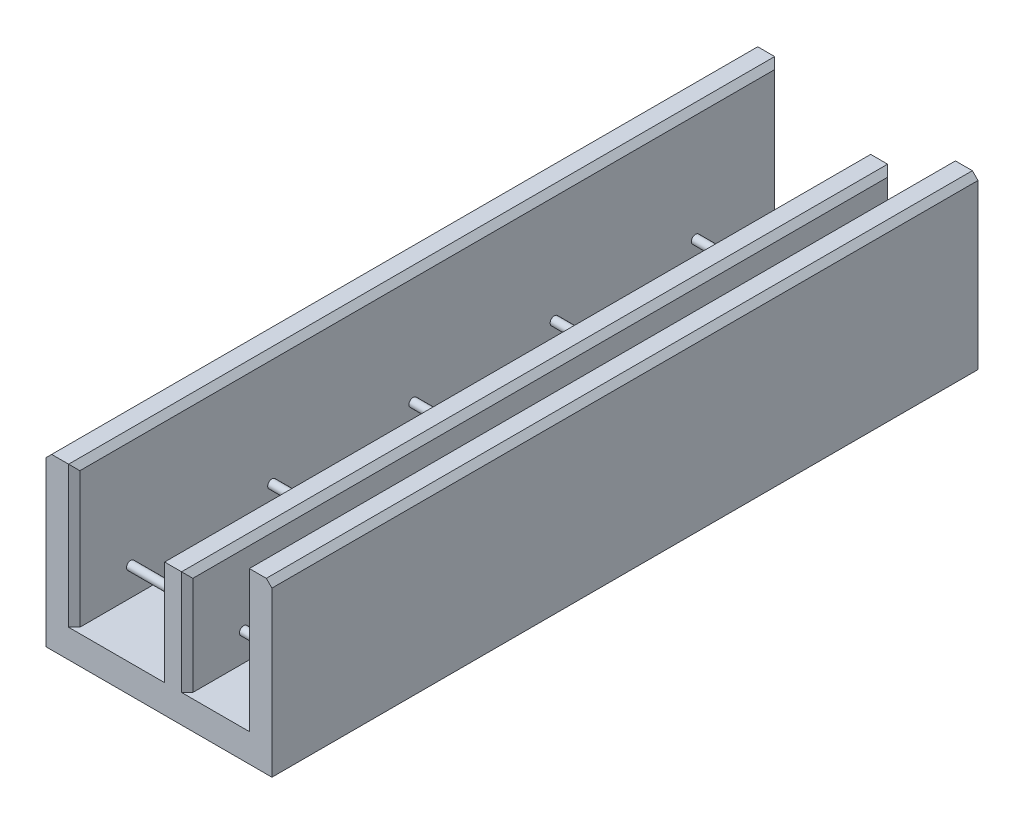
ISO-10303-21;
HEADER;
FILE_DESCRIPTION(('STEP AP214'),'2;1');
FILE_NAME('part.step','',(''),(''),'','','');
FILE_SCHEMA(('AUTOMOTIVE_DESIGN { 1 0 10303 214 1 1 1 1 }'));
ENDSEC;
DATA;
#1=APPLICATION_CONTEXT('core data for automotive mechanical design processes');
#2=APPLICATION_PROTOCOL_DEFINITION('international standard','automotive_design',2000,#1);
#3=PRODUCT_CONTEXT('',#1,'mechanical');
#4=PRODUCT('Part','Part','',(#3));
#5=PRODUCT_RELATED_PRODUCT_CATEGORY('part','',(#4));
#6=PRODUCT_DEFINITION_FORMATION('','',#4);
#7=PRODUCT_DEFINITION_CONTEXT('part definition',#1,'design');
#8=PRODUCT_DEFINITION('design','',#6,#7);
#9=PRODUCT_DEFINITION_SHAPE('','',#8);
#10=(LENGTH_UNIT() NAMED_UNIT(*) SI_UNIT(.MILLI.,.METRE.));
#11=(NAMED_UNIT(*) PLANE_ANGLE_UNIT() SI_UNIT($,.RADIAN.));
#12=(NAMED_UNIT(*) SI_UNIT($,.STERADIAN.) SOLID_ANGLE_UNIT());
#13=UNCERTAINTY_MEASURE_WITH_UNIT(LENGTH_MEASURE(1.E-05),#10,'distance_accuracy_value','');
#14=(GEOMETRIC_REPRESENTATION_CONTEXT(3) GLOBAL_UNCERTAINTY_ASSIGNED_CONTEXT((#13)) GLOBAL_UNIT_ASSIGNED_CONTEXT((#10,
#11,#12)) REPRESENTATION_CONTEXT('',''));
#15=CARTESIAN_POINT('',(0.,0.,0.));
#16=DIRECTION('',(0.,0.,1.));
#17=DIRECTION('',(1.,0.,0.));
#18=AXIS2_PLACEMENT_3D('',#15,#16,#17);
#19=CARTESIAN_POINT('',(0.,600.,2500.));
#20=DIRECTION('',(-1.,0.,0.));
#21=DIRECTION('',(0.,0.,1.));
#22=AXIS2_PLACEMENT_3D('',#19,#20,#21);
#23=PLANE('',#22);
#24=DIRECTION('',(0.,1.,0.));
#25=VECTOR('',#24,1.);
#26=CARTESIAN_POINT('',(0.,600.,0.));
#27=LINE('',#26,#25);
#28=CARTESIAN_POINT('',(0.,0.,0.));
#29=VERTEX_POINT('',#28);
#30=CARTESIAN_POINT('',(0.,580.,0.));
#31=VERTEX_POINT('',#30);
#32=EDGE_CURVE('E219',#29,#31,#27,.T.);
#33=ORIENTED_EDGE('',*,*,#32,.T.);
#34=DIRECTION('',(0.,0.,1.));
#35=VECTOR('',#34,1.);
#36=CARTESIAN_POINT('',(0.,580.,2500.));
#37=LINE('',#36,#35);
#38=CARTESIAN_POINT('',(0.,580.,2500.));
#39=VERTEX_POINT('',#38);
#40=EDGE_CURVE('E289',#31,#39,#37,.T.);
#41=ORIENTED_EDGE('',*,*,#40,.T.);
#42=DIRECTION('',(0.,1.,0.));
#43=VECTOR('',#42,1.);
#44=CARTESIAN_POINT('',(0.,600.,2500.));
#45=LINE('',#44,#43);
#46=CARTESIAN_POINT('',(0.,0.,2500.));
#47=VERTEX_POINT('',#46);
#48=EDGE_CURVE('E238',#47,#39,#45,.T.);
#49=ORIENTED_EDGE('',*,*,#48,.F.);
#50=DIRECTION('',(0.,0.,-1.));
#51=VECTOR('',#50,1.);
#52=CARTESIAN_POINT('',(0.,0.,2500.));
#53=LINE('',#52,#51);
#54=EDGE_CURVE('E210',#47,#29,#53,.T.);
#55=ORIENTED_EDGE('',*,*,#54,.T.);
#56=EDGE_LOOP('',(#33,#41,#49,#55));
#57=FACE_BOUND('',#56,.T.);
#58=ADVANCED_FACE('F37',(#57),#23,.F.);
#59=CARTESIAN_POINT('',(-99.9999999999998,600.,2500.));
#60=DIRECTION('',(0.,-1.,0.));
#61=DIRECTION('',(0.,0.,-1.));
#62=AXIS2_PLACEMENT_3D('',#59,#60,#61);
#63=PLANE('',#62);
#64=DIRECTION('',(-1.,0.,0.));
#65=VECTOR('',#64,1.);
#66=CARTESIAN_POINT('',(-99.9999999999998,600.,2500.));
#67=LINE('',#66,#65);
#68=CARTESIAN_POINT('',(-20.,600.,2500.));
#69=VERTEX_POINT('',#68);
#70=CARTESIAN_POINT('',(-80.,600.,2500.));
#71=VERTEX_POINT('',#70);
#72=EDGE_CURVE('E369',#69,#71,#67,.T.);
#73=ORIENTED_EDGE('',*,*,#72,.F.);
#74=DIRECTION('',(0.,0.,-1.));
#75=VECTOR('',#74,1.);
#76=CARTESIAN_POINT('',(-20.,600.,2500.));
#77=LINE('',#76,#75);
#78=CARTESIAN_POINT('',(-20.,600.,0.));
#79=VERTEX_POINT('',#78);
#80=EDGE_CURVE('E286',#69,#79,#77,.T.);
#81=ORIENTED_EDGE('',*,*,#80,.T.);
#82=DIRECTION('',(-1.,0.,0.));
#83=VECTOR('',#82,1.);
#84=CARTESIAN_POINT('',(-99.9999999999998,600.,0.));
#85=LINE('',#84,#83);
#86=CARTESIAN_POINT('',(-80.,600.,0.));
#87=VERTEX_POINT('',#86);
#88=EDGE_CURVE('E222',#79,#87,#85,.T.);
#89=ORIENTED_EDGE('',*,*,#88,.T.);
#90=DIRECTION('',(0.,0.,1.));
#91=VECTOR('',#90,1.);
#92=CARTESIAN_POINT('',(-80.,600.,2500.));
#93=LINE('',#92,#91);
#94=EDGE_CURVE('E284',#87,#71,#93,.T.);
#95=ORIENTED_EDGE('',*,*,#94,.T.);
#96=EDGE_LOOP('',(#73,#81,#89,#95));
#97=FACE_BOUND('',#96,.T.);
#98=ADVANCED_FACE('F398',(#97),#63,.F.);
#99=CARTESIAN_POINT('',(-99.9999999999998,99.9999999999999,2500.));
#100=DIRECTION('',(1.,0.,0.));
#101=DIRECTION('',(0.,0.,-1.));
#102=AXIS2_PLACEMENT_3D('',#99,#100,#101);
#103=PLANE('',#102);
#104=CARTESIAN_POINT('',(-99.9999999999998,200.,2300.));
#105=DIRECTION('',(1.,0.,0.));
#106=DIRECTION('',(0.,0.,-1.));
#107=AXIS2_PLACEMENT_3D('',#104,#105,#106);
#108=CIRCLE('',#107,15.);
#109=CARTESIAN_POINT('',(-99.9999999999998,200.,2285.));
#110=VERTEX_POINT('',#109);
#111=EDGE_CURVE('E888',#110,#110,#108,.F.);
#112=ORIENTED_EDGE('',*,*,#111,.F.);
#113=EDGE_LOOP('',(#112));
#114=FACE_BOUND('',#113,.T.);
#115=CARTESIAN_POINT('',(-99.9999999999998,200.,1800.));
#116=DIRECTION('',(1.,0.,0.));
#117=DIRECTION('',(0.,0.,-1.));
#118=AXIS2_PLACEMENT_3D('',#115,#116,#117);
#119=CIRCLE('',#118,15.);
#120=CARTESIAN_POINT('',(-99.9999999999998,200.,1785.));
#121=VERTEX_POINT('',#120);
#122=EDGE_CURVE('E879',#121,#121,#119,.F.);
#123=ORIENTED_EDGE('',*,*,#122,.F.);
#124=EDGE_LOOP('',(#123));
#125=FACE_BOUND('',#124,.T.);
#126=CARTESIAN_POINT('',(-99.9999999999998,200.,1300.));
#127=DIRECTION('',(1.,0.,0.));
#128=DIRECTION('',(0.,0.,-1.));
#129=AXIS2_PLACEMENT_3D('',#126,#127,#128);
#130=CIRCLE('',#129,15.);
#131=CARTESIAN_POINT('',(-99.9999999999998,200.,1285.));
#132=VERTEX_POINT('',#131);
#133=EDGE_CURVE('E869',#132,#132,#130,.F.);
#134=ORIENTED_EDGE('',*,*,#133,.F.);
#135=EDGE_LOOP('',(#134));
#136=FACE_BOUND('',#135,.T.);
#137=CARTESIAN_POINT('',(-99.9999999999998,200.,800.));
#138=DIRECTION('',(1.,0.,0.));
#139=DIRECTION('',(0.,0.,-1.));
#140=AXIS2_PLACEMENT_3D('',#137,#138,#139);
#141=CIRCLE('',#140,15.);
#142=CARTESIAN_POINT('',(-99.9999999999998,200.,785.));
#143=VERTEX_POINT('',#142);
#144=EDGE_CURVE('E858',#143,#143,#141,.F.);
#145=ORIENTED_EDGE('',*,*,#144,.F.);
#146=EDGE_LOOP('',(#145));
#147=FACE_BOUND('',#146,.T.);
#148=CARTESIAN_POINT('',(-99.9999999999998,200.,300.));
#149=DIRECTION('',(1.,0.,0.));
#150=DIRECTION('',(0.,0.,-1.));
#151=AXIS2_PLACEMENT_3D('',#148,#149,#150);
#152=CIRCLE('',#151,15.);
#153=CARTESIAN_POINT('',(-99.9999999999998,200.,285.));
#154=VERTEX_POINT('',#153);
#155=EDGE_CURVE('E552',#154,#154,#152,.F.);
#156=ORIENTED_EDGE('',*,*,#155,.F.);
#157=EDGE_LOOP('',(#156));
#158=FACE_BOUND('',#157,.T.);
#159=DIRECTION('',(0.,0.,-1.));
#160=VECTOR('',#159,1.);
#161=CARTESIAN_POINT('',(-99.9999999999998,580.,2500.));
#162=LINE('',#161,#160);
#163=CARTESIAN_POINT('',(-99.9999999999998,580.,2480.));
#164=VERTEX_POINT('',#163);
#165=CARTESIAN_POINT('',(-99.9999999999998,580.,19.9999999999996));
#166=VERTEX_POINT('',#165);
#167=EDGE_CURVE('E300',#164,#166,#162,.T.);
#168=ORIENTED_EDGE('',*,*,#167,.T.);
#169=DIRECTION('',(0.,-1.,0.));
#170=VECTOR('',#169,1.);
#171=CARTESIAN_POINT('',(-99.9999999999998,99.9999999999999,19.9999999999996));
#172=LINE('',#171,#170);
#173=CARTESIAN_POINT('',(-99.9999999999998,99.9999999999999,19.9999999999996));
#174=VERTEX_POINT('',#173);
#175=EDGE_CURVE('E302',#166,#174,#172,.T.);
#176=ORIENTED_EDGE('',*,*,#175,.T.);
#177=DIRECTION('',(0.,0.,-1.));
#178=VECTOR('',#177,1.);
#179=CARTESIAN_POINT('',(-99.9999999999998,99.9999999999999,2500.));
#180=LINE('',#179,#178);
#181=CARTESIAN_POINT('',(-99.9999999999998,99.9999999999999,2480.));
#182=VERTEX_POINT('',#181);
#183=EDGE_CURVE('E248',#182,#174,#180,.T.);
#184=ORIENTED_EDGE('',*,*,#183,.F.);
#185=DIRECTION('',(0.,1.,0.));
#186=VECTOR('',#185,1.);
#187=CARTESIAN_POINT('',(-99.9999999999998,99.9999999999999,2480.));
#188=LINE('',#187,#186);
#189=EDGE_CURVE('E298',#182,#164,#188,.T.);
#190=ORIENTED_EDGE('',*,*,#189,.T.);
#191=EDGE_LOOP('',(#168,#176,#184,#190));
#192=FACE_BOUND('',#191,.T.);
#193=ADVANCED_FACE('F418',(#114,#125,#136,#147,#158,#192),#103,.F.);
#194=CARTESIAN_POINT('',(-300.,99.9999999999999,2500.));
#195=DIRECTION('',(0.,-1.,0.));
#196=DIRECTION('',(1.,0.,0.));
#197=AXIS2_PLACEMENT_3D('',#194,#195,#196);
#198=PLANE('',#197);
#199=DIRECTION('',(-1.,0.,0.));
#200=VECTOR('',#199,1.);
#201=CARTESIAN_POINT('',(-300.,99.9999999999999,0.));
#202=LINE('',#201,#200);
#203=CARTESIAN_POINT('',(-80.,99.9999999999999,0.));
#204=VERTEX_POINT('',#203);
#205=CARTESIAN_POINT('',(-320.,99.9999999999999,0.));
#206=VERTEX_POINT('',#205);
#207=EDGE_CURVE('E226',#204,#206,#202,.T.);
#208=ORIENTED_EDGE('',*,*,#207,.T.);
#209=DIRECTION('',(0.707106781186552,0.,0.707106781186543));
#210=VECTOR('',#209,1.);
#211=CARTESIAN_POINT('',(940.,99.9999999999999,1259.99999999999));
#212=LINE('',#211,#210);
#213=CARTESIAN_POINT('',(-300.,99.9999999999999,19.9999999999996));
#214=VERTEX_POINT('',#213);
#215=EDGE_CURVE('E330',#206,#214,#212,.T.);
#216=ORIENTED_EDGE('',*,*,#215,.T.);
#217=DIRECTION('',(0.,0.,-1.));
#218=VECTOR('',#217,1.);
#219=CARTESIAN_POINT('',(-300.,99.9999999999999,2500.));
#220=LINE('',#219,#218);
#221=CARTESIAN_POINT('',(-300.,99.9999999999999,2480.));
#222=VERTEX_POINT('',#221);
#223=EDGE_CURVE('E245',#222,#214,#220,.T.);
#224=ORIENTED_EDGE('',*,*,#223,.F.);
#225=DIRECTION('',(0.707106781186552,0.,-0.707106781186543));
#226=VECTOR('',#225,1.);
#227=CARTESIAN_POINT('',(-310.,99.9999999999999,2490.));
#228=LINE('',#227,#226);
#229=CARTESIAN_POINT('',(-320.,99.9999999999999,2500.));
#230=VERTEX_POINT('',#229);
#231=EDGE_CURVE('E332',#222,#230,#228,.F.);
#232=ORIENTED_EDGE('',*,*,#231,.T.);
#233=DIRECTION('',(-1.,0.,0.));
#234=VECTOR('',#233,1.);
#235=CARTESIAN_POINT('',(-300.,99.9999999999999,2500.));
#236=LINE('',#235,#234);
#237=CARTESIAN_POINT('',(-80.,99.9999999999999,2500.));
#238=VERTEX_POINT('',#237);
#239=EDGE_CURVE('E372',#238,#230,#236,.T.);
#240=ORIENTED_EDGE('',*,*,#239,.F.);
#241=DIRECTION('',(0.707106781186551,0.,0.707106781186544));
#242=VECTOR('',#241,1.);
#243=CARTESIAN_POINT('',(-190.000000000001,99.9999999999999,2390.));
#244=LINE('',#243,#242);
#245=EDGE_CURVE('E328',#238,#182,#244,.F.);
#246=ORIENTED_EDGE('',*,*,#245,.T.);
#247=ORIENTED_EDGE('',*,*,#183,.T.);
#248=DIRECTION('',(0.707106781186551,0.,-0.707106781186544));
#249=VECTOR('',#248,1.);
#250=CARTESIAN_POINT('',(-1440.,99.9999999999998,1359.99999999999));
#251=LINE('',#250,#249);
#252=EDGE_CURVE('E325',#174,#204,#251,.T.);
#253=ORIENTED_EDGE('',*,*,#252,.T.);
#254=EDGE_LOOP('',(#208,#216,#224,#232,#240,#246,#247,#253));
#255=FACE_BOUND('',#254,.T.);
#256=ADVANCED_FACE('F416',(#255),#198,.F.);
#257=CARTESIAN_POINT('',(-300.,470.,2500.));
#258=DIRECTION('',(-1.,0.,0.));
#259=DIRECTION('',(0.,-1.,0.));
#260=AXIS2_PLACEMENT_3D('',#257,#258,#259);
#261=PLANE('',#260);
#262=CARTESIAN_POINT('',(-300.,200.,2300.));
#263=DIRECTION('',(-1.,0.,0.));
#264=DIRECTION('',(0.,-1.,0.));
#265=AXIS2_PLACEMENT_3D('',#262,#263,#264);
#266=CIRCLE('',#265,15.);
#267=CARTESIAN_POINT('',(-300.,185.,2300.));
#268=VERTEX_POINT('',#267);
#269=EDGE_CURVE('E537',#268,#268,#266,.T.);
#270=ORIENTED_EDGE('',*,*,#269,.T.);
#271=EDGE_LOOP('',(#270));
#272=FACE_BOUND('',#271,.T.);
#273=CARTESIAN_POINT('',(-300.,200.,1800.));
#274=DIRECTION('',(-1.,0.,0.));
#275=DIRECTION('',(0.,-1.,0.));
#276=AXIS2_PLACEMENT_3D('',#273,#274,#275);
#277=CIRCLE('',#276,15.);
#278=CARTESIAN_POINT('',(-300.,185.,1800.));
#279=VERTEX_POINT('',#278);
#280=EDGE_CURVE('E541',#279,#279,#277,.T.);
#281=ORIENTED_EDGE('',*,*,#280,.T.);
#282=EDGE_LOOP('',(#281));
#283=FACE_BOUND('',#282,.T.);
#284=CARTESIAN_POINT('',(-300.,200.,1300.));
#285=DIRECTION('',(-1.,0.,0.));
#286=DIRECTION('',(0.,-1.,0.));
#287=AXIS2_PLACEMENT_3D('',#284,#285,#286);
#288=CIRCLE('',#287,15.);
#289=CARTESIAN_POINT('',(-300.,185.,1300.));
#290=VERTEX_POINT('',#289);
#291=EDGE_CURVE('E545',#290,#290,#288,.T.);
#292=ORIENTED_EDGE('',*,*,#291,.T.);
#293=EDGE_LOOP('',(#292));
#294=FACE_BOUND('',#293,.T.);
#295=CARTESIAN_POINT('',(-300.,200.,800.));
#296=DIRECTION('',(-1.,0.,0.));
#297=DIRECTION('',(0.,-1.,0.));
#298=AXIS2_PLACEMENT_3D('',#295,#296,#297);
#299=CIRCLE('',#298,15.);
#300=CARTESIAN_POINT('',(-300.,185.,800.));
#301=VERTEX_POINT('',#300);
#302=EDGE_CURVE('E548',#301,#301,#299,.T.);
#303=ORIENTED_EDGE('',*,*,#302,.T.);
#304=EDGE_LOOP('',(#303));
#305=FACE_BOUND('',#304,.T.);
#306=CARTESIAN_POINT('',(-300.,200.,300.));
#307=DIRECTION('',(-1.,0.,0.));
#308=DIRECTION('',(0.,-1.,0.));
#309=AXIS2_PLACEMENT_3D('',#306,#307,#308);
#310=CIRCLE('',#309,15.);
#311=CARTESIAN_POINT('',(-300.,185.,300.));
#312=VERTEX_POINT('',#311);
#313=EDGE_CURVE('E353',#312,#312,#310,.T.);
#314=ORIENTED_EDGE('',*,*,#313,.T.);
#315=EDGE_LOOP('',(#314));
#316=FACE_BOUND('',#315,.T.);
#317=ORIENTED_EDGE('',*,*,#223,.T.);
#318=DIRECTION('',(0.,1.,0.));
#319=VECTOR('',#318,1.);
#320=CARTESIAN_POINT('',(-300.,470.,19.9999999999996));
#321=LINE('',#320,#319);
#322=CARTESIAN_POINT('',(-300.,450.,19.9999999999996));
#323=VERTEX_POINT('',#322);
#324=EDGE_CURVE('E309',#214,#323,#321,.T.);
#325=ORIENTED_EDGE('',*,*,#324,.T.);
#326=DIRECTION('',(0.,0.,1.));
#327=VECTOR('',#326,1.);
#328=CARTESIAN_POINT('',(-300.,450.,2500.));
#329=LINE('',#328,#327);
#330=CARTESIAN_POINT('',(-300.,450.,2480.));
#331=VERTEX_POINT('',#330);
#332=EDGE_CURVE('E305',#323,#331,#329,.T.);
#333=ORIENTED_EDGE('',*,*,#332,.T.);
#334=DIRECTION('',(0.,-1.,0.));
#335=VECTOR('',#334,1.);
#336=CARTESIAN_POINT('',(-300.,470.,2480.));
#337=LINE('',#336,#335);
#338=EDGE_CURVE('E307',#331,#222,#337,.T.);
#339=ORIENTED_EDGE('',*,*,#338,.T.);
#340=EDGE_LOOP('',(#317,#325,#333,#339));
#341=FACE_BOUND('',#340,.T.);
#342=ADVANCED_FACE('F426',(#272,#283,#294,#305,#316,#341),#261,.F.);
#343=CARTESIAN_POINT('',(-400.,470.,2500.));
#344=DIRECTION('',(0.,-1.,0.));
#345=DIRECTION('',(0.,0.,-1.));
#346=AXIS2_PLACEMENT_3D('',#343,#344,#345);
#347=PLANE('',#346);
#348=DIRECTION('',(-1.,0.,0.));
#349=VECTOR('',#348,1.);
#350=CARTESIAN_POINT('',(-400.,470.,2500.));
#351=LINE('',#350,#349);
#352=CARTESIAN_POINT('',(-320.,470.,2500.));
#353=VERTEX_POINT('',#352);
#354=CARTESIAN_POINT('',(-380.,470.,2500.));
#355=VERTEX_POINT('',#354);
#356=EDGE_CURVE('E374',#353,#355,#351,.T.);
#357=ORIENTED_EDGE('',*,*,#356,.F.);
#358=DIRECTION('',(0.,0.,-1.));
#359=VECTOR('',#358,1.);
#360=CARTESIAN_POINT('',(-320.,470.,2500.));
#361=LINE('',#360,#359);
#362=CARTESIAN_POINT('',(-320.,470.,0.));
#363=VERTEX_POINT('',#362);
#364=EDGE_CURVE('E314',#353,#363,#361,.T.);
#365=ORIENTED_EDGE('',*,*,#364,.T.);
#366=DIRECTION('',(-1.,0.,0.));
#367=VECTOR('',#366,1.);
#368=CARTESIAN_POINT('',(-400.,470.,0.));
#369=LINE('',#368,#367);
#370=CARTESIAN_POINT('',(-380.,470.,0.));
#371=VERTEX_POINT('',#370);
#372=EDGE_CURVE('E228',#363,#371,#369,.T.);
#373=ORIENTED_EDGE('',*,*,#372,.T.);
#374=DIRECTION('',(0.,0.,1.));
#375=VECTOR('',#374,1.);
#376=CARTESIAN_POINT('',(-380.,470.,2500.));
#377=LINE('',#376,#375);
#378=EDGE_CURVE('E312',#371,#355,#377,.T.);
#379=ORIENTED_EDGE('',*,*,#378,.T.);
#380=EDGE_LOOP('',(#357,#365,#373,#379));
#381=FACE_BOUND('',#380,.T.);
#382=ADVANCED_FACE('F487',(#381),#347,.F.);
#383=CARTESIAN_POINT('',(-400.,99.9999999999999,2500.));
#384=DIRECTION('',(1.,0.,0.));
#385=DIRECTION('',(0.,0.,-1.));
#386=AXIS2_PLACEMENT_3D('',#383,#384,#385);
#387=PLANE('',#386);
#388=CARTESIAN_POINT('',(-400.,200.,2300.));
#389=DIRECTION('',(1.,0.,0.));
#390=DIRECTION('',(0.,0.,-1.));
#391=AXIS2_PLACEMENT_3D('',#388,#389,#390);
#392=CIRCLE('',#391,15.);
#393=CARTESIAN_POINT('',(-400.,200.,2285.));
#394=VERTEX_POINT('',#393);
#395=EDGE_CURVE('E883',#394,#394,#392,.T.);
#396=ORIENTED_EDGE('',*,*,#395,.T.);
#397=EDGE_LOOP('',(#396));
#398=FACE_BOUND('',#397,.T.);
#399=CARTESIAN_POINT('',(-400.,200.,1800.));
#400=DIRECTION('',(1.,0.,0.));
#401=DIRECTION('',(0.,0.,-1.));
#402=AXIS2_PLACEMENT_3D('',#399,#400,#401);
#403=CIRCLE('',#402,15.);
#404=CARTESIAN_POINT('',(-400.,200.,1785.));
#405=VERTEX_POINT('',#404);
#406=EDGE_CURVE('E873',#405,#405,#403,.T.);
#407=ORIENTED_EDGE('',*,*,#406,.T.);
#408=EDGE_LOOP('',(#407));
#409=FACE_BOUND('',#408,.T.);
#410=CARTESIAN_POINT('',(-400.,200.,1300.));
#411=DIRECTION('',(1.,0.,0.));
#412=DIRECTION('',(0.,0.,-1.));
#413=AXIS2_PLACEMENT_3D('',#410,#411,#412);
#414=CIRCLE('',#413,15.);
#415=CARTESIAN_POINT('',(-400.,200.,1285.));
#416=VERTEX_POINT('',#415);
#417=EDGE_CURVE('E863',#416,#416,#414,.T.);
#418=ORIENTED_EDGE('',*,*,#417,.T.);
#419=EDGE_LOOP('',(#418));
#420=FACE_BOUND('',#419,.T.);
#421=CARTESIAN_POINT('',(-400.,200.,800.));
#422=DIRECTION('',(1.,0.,0.));
#423=DIRECTION('',(0.,0.,-1.));
#424=AXIS2_PLACEMENT_3D('',#421,#422,#423);
#425=CIRCLE('',#424,15.);
#426=CARTESIAN_POINT('',(-400.,200.,785.));
#427=VERTEX_POINT('',#426);
#428=EDGE_CURVE('E553',#427,#427,#425,.T.);
#429=ORIENTED_EDGE('',*,*,#428,.T.);
#430=EDGE_LOOP('',(#429));
#431=FACE_BOUND('',#430,.T.);
#432=CARTESIAN_POINT('',(-400.,200.,300.));
#433=DIRECTION('',(1.,0.,0.));
#434=DIRECTION('',(0.,0.,-1.));
#435=AXIS2_PLACEMENT_3D('',#432,#433,#434);
#436=CIRCLE('',#435,15.);
#437=CARTESIAN_POINT('',(-400.,200.,285.));
#438=VERTEX_POINT('',#437);
#439=EDGE_CURVE('E359',#438,#438,#436,.T.);
#440=ORIENTED_EDGE('',*,*,#439,.T.);
#441=EDGE_LOOP('',(#440));
#442=FACE_BOUND('',#441,.T.);
#443=DIRECTION('',(0.,0.,-1.));
#444=VECTOR('',#443,1.);
#445=CARTESIAN_POINT('',(-400.,450.,2500.));
#446=LINE('',#445,#444);
#447=CARTESIAN_POINT('',(-400.,450.,2480.));
#448=VERTEX_POINT('',#447);
#449=CARTESIAN_POINT('',(-400.,450.,20.));
#450=VERTEX_POINT('',#449);
#451=EDGE_CURVE('E54',#448,#450,#446,.T.);
#452=ORIENTED_EDGE('',*,*,#451,.T.);
#453=DIRECTION('',(0.,-1.,0.));
#454=VECTOR('',#453,1.);
#455=CARTESIAN_POINT('',(-400.,99.9999999999999,20.));
#456=LINE('',#455,#454);
#457=CARTESIAN_POINT('',(-400.,99.9999999999999,20.));
#458=VERTEX_POINT('',#457);
#459=EDGE_CURVE('E318',#450,#458,#456,.T.);
#460=ORIENTED_EDGE('',*,*,#459,.T.);
#461=DIRECTION('',(0.,0.,-1.));
#462=VECTOR('',#461,1.);
#463=CARTESIAN_POINT('',(-400.,99.9999999999999,2500.));
#464=LINE('',#463,#462);
#465=CARTESIAN_POINT('',(-400.,99.9999999999999,2480.));
#466=VERTEX_POINT('',#465);
#467=EDGE_CURVE('E242',#466,#458,#464,.T.);
#468=ORIENTED_EDGE('',*,*,#467,.F.);
#469=DIRECTION('',(0.,1.,0.));
#470=VECTOR('',#469,1.);
#471=CARTESIAN_POINT('',(-400.,99.9999999999999,2480.));
#472=LINE('',#471,#470);
#473=EDGE_CURVE('E59',#466,#448,#472,.T.);
#474=ORIENTED_EDGE('',*,*,#473,.T.);
#475=EDGE_LOOP('',(#452,#460,#468,#474));
#476=FACE_BOUND('',#475,.T.);
#477=ADVANCED_FACE('F498',(#398,#409,#420,#431,#442,#476),#387,.F.);
#478=CARTESIAN_POINT('',(-700.,99.9999999999999,2500.));
#479=DIRECTION('',(0.,-1.,0.));
#480=DIRECTION('',(1.,0.,0.));
#481=AXIS2_PLACEMENT_3D('',#478,#479,#480);
#482=PLANE('',#481);
#483=DIRECTION('',(-1.,0.,0.));
#484=VECTOR('',#483,1.);
#485=CARTESIAN_POINT('',(-700.,99.9999999999999,0.));
#486=LINE('',#485,#484);
#487=CARTESIAN_POINT('',(-380.,99.9999999999999,0.));
#488=VERTEX_POINT('',#487);
#489=CARTESIAN_POINT('',(-720.,99.9999999999999,0.));
#490=VERTEX_POINT('',#489);
#491=EDGE_CURVE('E231',#488,#490,#486,.T.);
#492=ORIENTED_EDGE('',*,*,#491,.T.);
#493=DIRECTION('',(0.707106781186548,0.,0.707106781186547));
#494=VECTOR('',#493,1.);
#495=CARTESIAN_POINT('',(540.,99.9999999999998,1260.));
#496=LINE('',#495,#494);
#497=CARTESIAN_POINT('',(-700.,99.9999999999999,20.));
#498=VERTEX_POINT('',#497);
#499=EDGE_CURVE('E320',#490,#498,#496,.T.);
#500=ORIENTED_EDGE('',*,*,#499,.T.);
#501=DIRECTION('',(0.,0.,-1.));
#502=VECTOR('',#501,1.);
#503=CARTESIAN_POINT('',(-700.,99.9999999999999,2500.));
#504=LINE('',#503,#502);
#505=CARTESIAN_POINT('',(-700.,99.9999999999999,2480.));
#506=VERTEX_POINT('',#505);
#507=EDGE_CURVE('E209',#506,#498,#504,.T.);
#508=ORIENTED_EDGE('',*,*,#507,.F.);
#509=DIRECTION('',(0.707106781186548,0.,-0.707106781186547));
#510=VECTOR('',#509,1.);
#511=CARTESIAN_POINT('',(-710.,99.9999999999999,2490.));
#512=LINE('',#511,#510);
#513=CARTESIAN_POINT('',(-720.,99.9999999999999,2500.));
#514=VERTEX_POINT('',#513);
#515=EDGE_CURVE('E322',#506,#514,#512,.F.);
#516=ORIENTED_EDGE('',*,*,#515,.T.);
#517=DIRECTION('',(-1.,0.,0.));
#518=VECTOR('',#517,1.);
#519=CARTESIAN_POINT('',(-700.,99.9999999999999,2500.));
#520=LINE('',#519,#518);
#521=CARTESIAN_POINT('',(-380.,99.9999999999999,2500.));
#522=VERTEX_POINT('',#521);
#523=EDGE_CURVE('E377',#522,#514,#520,.T.);
#524=ORIENTED_EDGE('',*,*,#523,.F.);
#525=DIRECTION('',(0.707106781186551,0.,0.707106781186544));
#526=VECTOR('',#525,1.);
#527=CARTESIAN_POINT('',(-540.000000000001,99.9999999999999,2340.));
#528=LINE('',#527,#526);
#529=EDGE_CURVE('E11',#522,#466,#528,.F.);
#530=ORIENTED_EDGE('',*,*,#529,.T.);
#531=ORIENTED_EDGE('',*,*,#467,.T.);
#532=DIRECTION('',(0.707106781186551,0.,-0.707106781186544));
#533=VECTOR('',#532,1.);
#534=CARTESIAN_POINT('',(-1790.,99.9999999999999,1409.99999999999));
#535=LINE('',#534,#533);
#536=EDGE_CURVE('E46',#458,#488,#535,.T.);
#537=ORIENTED_EDGE('',*,*,#536,.T.);
#538=EDGE_LOOP('',(#492,#500,#508,#516,#524,#530,#531,#537));
#539=FACE_BOUND('',#538,.T.);
#540=ADVANCED_FACE('F499',(#539),#482,.F.);
#541=CARTESIAN_POINT('',(-700.,600.,2500.));
#542=DIRECTION('',(-1.,0.,0.));
#543=DIRECTION('',(0.,-1.,0.));
#544=AXIS2_PLACEMENT_3D('',#541,#542,#543);
#545=PLANE('',#544);
#546=CARTESIAN_POINT('',(-700.,200.,2300.));
#547=DIRECTION('',(-1.,0.,0.));
#548=DIRECTION('',(0.,-1.,0.));
#549=AXIS2_PLACEMENT_3D('',#546,#547,#548);
#550=CIRCLE('',#549,15.);
#551=CARTESIAN_POINT('',(-700.,185.,2300.));
#552=VERTEX_POINT('',#551);
#553=EDGE_CURVE('E886',#552,#552,#550,.T.);
#554=ORIENTED_EDGE('',*,*,#553,.T.);
#555=EDGE_LOOP('',(#554));
#556=FACE_BOUND('',#555,.T.);
#557=CARTESIAN_POINT('',(-700.,200.,1800.));
#558=DIRECTION('',(-1.,0.,0.));
#559=DIRECTION('',(0.,-1.,0.));
#560=AXIS2_PLACEMENT_3D('',#557,#558,#559);
#561=CIRCLE('',#560,15.);
#562=CARTESIAN_POINT('',(-700.,185.,1800.));
#563=VERTEX_POINT('',#562);
#564=EDGE_CURVE('E876',#563,#563,#561,.T.);
#565=ORIENTED_EDGE('',*,*,#564,.T.);
#566=EDGE_LOOP('',(#565));
#567=FACE_BOUND('',#566,.T.);
#568=CARTESIAN_POINT('',(-700.,200.,1300.));
#569=DIRECTION('',(-1.,0.,0.));
#570=DIRECTION('',(0.,-1.,0.));
#571=AXIS2_PLACEMENT_3D('',#568,#569,#570);
#572=CIRCLE('',#571,15.);
#573=CARTESIAN_POINT('',(-700.,185.,1300.));
#574=VERTEX_POINT('',#573);
#575=EDGE_CURVE('E866',#574,#574,#572,.T.);
#576=ORIENTED_EDGE('',*,*,#575,.T.);
#577=EDGE_LOOP('',(#576));
#578=FACE_BOUND('',#577,.T.);
#579=CARTESIAN_POINT('',(-700.,200.,800.));
#580=DIRECTION('',(-1.,0.,0.));
#581=DIRECTION('',(0.,-1.,0.));
#582=AXIS2_PLACEMENT_3D('',#579,#580,#581);
#583=CIRCLE('',#582,15.);
#584=CARTESIAN_POINT('',(-700.,185.,800.));
#585=VERTEX_POINT('',#584);
#586=EDGE_CURVE('E558',#585,#585,#583,.T.);
#587=ORIENTED_EDGE('',*,*,#586,.T.);
#588=EDGE_LOOP('',(#587));
#589=FACE_BOUND('',#588,.T.);
#590=CARTESIAN_POINT('',(-700.,200.,300.));
#591=DIRECTION('',(-1.,0.,0.));
#592=DIRECTION('',(0.,-1.,0.));
#593=AXIS2_PLACEMENT_3D('',#590,#591,#592);
#594=CIRCLE('',#593,15.);
#595=CARTESIAN_POINT('',(-700.,185.,300.));
#596=VERTEX_POINT('',#595);
#597=EDGE_CURVE('E364',#596,#596,#594,.T.);
#598=ORIENTED_EDGE('',*,*,#597,.T.);
#599=EDGE_LOOP('',(#598));
#600=FACE_BOUND('',#599,.T.);
#601=ORIENTED_EDGE('',*,*,#507,.T.);
#602=DIRECTION('',(0.,1.,0.));
#603=VECTOR('',#602,1.);
#604=CARTESIAN_POINT('',(-700.,600.,20.));
#605=LINE('',#604,#603);
#606=CARTESIAN_POINT('',(-700.,580.,20.));
#607=VERTEX_POINT('',#606);
#608=EDGE_CURVE('E295',#498,#607,#605,.T.);
#609=ORIENTED_EDGE('',*,*,#608,.T.);
#610=DIRECTION('',(0.,0.,1.));
#611=VECTOR('',#610,1.);
#612=CARTESIAN_POINT('',(-700.,580.,2500.));
#613=LINE('',#612,#611);
#614=CARTESIAN_POINT('',(-700.,580.,2480.));
#615=VERTEX_POINT('',#614);
#616=EDGE_CURVE('E293',#607,#615,#613,.T.);
#617=ORIENTED_EDGE('',*,*,#616,.T.);
#618=DIRECTION('',(0.,-1.,0.));
#619=VECTOR('',#618,1.);
#620=CARTESIAN_POINT('',(-700.,600.,2480.));
#621=LINE('',#620,#619);
#622=EDGE_CURVE('E291',#615,#506,#621,.T.);
#623=ORIENTED_EDGE('',*,*,#622,.T.);
#624=EDGE_LOOP('',(#601,#609,#617,#623));
#625=FACE_BOUND('',#624,.T.);
#626=ADVANCED_FACE('F511',(#556,#567,#578,#589,#600,#625),#545,.F.);
#627=CARTESIAN_POINT('',(-800.,600.,2500.));
#628=DIRECTION('',(0.,-1.,0.));
#629=DIRECTION('',(0.,0.,-1.));
#630=AXIS2_PLACEMENT_3D('',#627,#628,#629);
#631=PLANE('',#630);
#632=DIRECTION('',(-1.,0.,0.));
#633=VECTOR('',#632,1.);
#634=CARTESIAN_POINT('',(-800.,600.,0.));
#635=LINE('',#634,#633);
#636=CARTESIAN_POINT('',(-720.,600.,0.));
#637=VERTEX_POINT('',#636);
#638=CARTESIAN_POINT('',(-780.,600.,0.));
#639=VERTEX_POINT('',#638);
#640=EDGE_CURVE('E233',#637,#639,#635,.T.);
#641=ORIENTED_EDGE('',*,*,#640,.T.);
#642=DIRECTION('',(0.,0.,1.));
#643=VECTOR('',#642,1.);
#644=CARTESIAN_POINT('',(-780.,600.,2500.));
#645=LINE('',#644,#643);
#646=CARTESIAN_POINT('',(-780.,600.,2500.));
#647=VERTEX_POINT('',#646);
#648=EDGE_CURVE('E269',#639,#647,#645,.T.);
#649=ORIENTED_EDGE('',*,*,#648,.T.);
#650=DIRECTION('',(-1.,0.,0.));
#651=VECTOR('',#650,1.);
#652=CARTESIAN_POINT('',(-800.,600.,2500.));
#653=LINE('',#652,#651);
#654=CARTESIAN_POINT('',(-720.,600.,2500.));
#655=VERTEX_POINT('',#654);
#656=EDGE_CURVE('E200',#655,#647,#653,.T.);
#657=ORIENTED_EDGE('',*,*,#656,.F.);
#658=DIRECTION('',(0.,0.,-1.));
#659=VECTOR('',#658,1.);
#660=CARTESIAN_POINT('',(-720.,600.,2500.));
#661=LINE('',#660,#659);
#662=EDGE_CURVE('E267',#655,#637,#661,.T.);
#663=ORIENTED_EDGE('',*,*,#662,.T.);
#664=EDGE_LOOP('',(#641,#649,#657,#663));
#665=FACE_BOUND('',#664,.T.);
#666=ADVANCED_FACE('F506',(#665),#631,.F.);
#667=CARTESIAN_POINT('',(-800.,0.,2500.));
#668=DIRECTION('',(1.,0.,0.));
#669=DIRECTION('',(0.,0.,-1.));
#670=AXIS2_PLACEMENT_3D('',#667,#668,#669);
#671=PLANE('',#670);
#672=DIRECTION('',(0.,-1.,0.));
#673=VECTOR('',#672,1.);
#674=CARTESIAN_POINT('',(-800.,0.,2500.));
#675=LINE('',#674,#673);
#676=CARTESIAN_POINT('',(-800.,580.,2500.));
#677=VERTEX_POINT('',#676);
#678=CARTESIAN_POINT('',(-800.,0.,2500.));
#679=VERTEX_POINT('',#678);
#680=EDGE_CURVE('E187',#677,#679,#675,.T.);
#681=ORIENTED_EDGE('',*,*,#680,.F.);
#682=DIRECTION('',(0.,0.,-1.));
#683=VECTOR('',#682,1.);
#684=CARTESIAN_POINT('',(-800.,580.,2500.));
#685=LINE('',#684,#683);
#686=CARTESIAN_POINT('',(-800.,580.,0.));
#687=VERTEX_POINT('',#686);
#688=EDGE_CURVE('E251',#677,#687,#685,.T.);
#689=ORIENTED_EDGE('',*,*,#688,.T.);
#690=DIRECTION('',(0.,-1.,0.));
#691=VECTOR('',#690,1.);
#692=CARTESIAN_POINT('',(-800.,0.,0.));
#693=LINE('',#692,#691);
#694=CARTESIAN_POINT('',(-800.,0.,0.));
#695=VERTEX_POINT('',#694);
#696=EDGE_CURVE('E206',#687,#695,#693,.T.);
#697=ORIENTED_EDGE('',*,*,#696,.T.);
#698=DIRECTION('',(0.,0.,-1.));
#699=VECTOR('',#698,1.);
#700=CARTESIAN_POINT('',(-800.,0.,2500.));
#701=LINE('',#700,#699);
#702=EDGE_CURVE('E203',#679,#695,#701,.T.);
#703=ORIENTED_EDGE('',*,*,#702,.F.);
#704=EDGE_LOOP('',(#681,#689,#697,#703));
#705=FACE_BOUND('',#704,.T.);
#706=ADVANCED_FACE('F204',(#705),#671,.F.);
#707=CARTESIAN_POINT('',(0.,0.,2500.));
#708=DIRECTION('',(0.,1.,0.));
#709=DIRECTION('',(-1.,0.,0.));
#710=AXIS2_PLACEMENT_3D('',#707,#708,#709);
#711=PLANE('',#710);
#712=DIRECTION('',(1.,0.,0.));
#713=VECTOR('',#712,1.);
#714=CARTESIAN_POINT('',(0.,0.,0.));
#715=LINE('',#714,#713);
#716=EDGE_CURVE('E237',#695,#29,#715,.T.);
#717=ORIENTED_EDGE('',*,*,#716,.T.);
#718=ORIENTED_EDGE('',*,*,#54,.F.);
#719=DIRECTION('',(1.,0.,0.));
#720=VECTOR('',#719,1.);
#721=CARTESIAN_POINT('',(0.,0.,2500.));
#722=LINE('',#721,#720);
#723=EDGE_CURVE('E193',#679,#47,#722,.T.);
#724=ORIENTED_EDGE('',*,*,#723,.F.);
#725=ORIENTED_EDGE('',*,*,#702,.T.);
#726=EDGE_LOOP('',(#717,#718,#724,#725));
#727=FACE_BOUND('',#726,.T.);
#728=ADVANCED_FACE('F212',(#727),#711,.F.);
#729=CARTESIAN_POINT('',(0.,0.,2500.));
#730=DIRECTION('',(0.,0.,-1.));
#731=DIRECTION('',(-1.,0.,0.));
#732=AXIS2_PLACEMENT_3D('',#729,#730,#731);
#733=PLANE('',#732);
#734=ORIENTED_EDGE('',*,*,#656,.T.);
#735=DIRECTION('',(0.707106781186551,0.707106781186544,0.));
#736=VECTOR('',#735,1.);
#737=CARTESIAN_POINT('',(-800.,580.,2500.));
#738=LINE('',#737,#736);
#739=EDGE_CURVE('E196',#647,#677,#738,.F.);
#740=ORIENTED_EDGE('',*,*,#739,.T.);
#741=ORIENTED_EDGE('',*,*,#680,.T.);
#742=ORIENTED_EDGE('',*,*,#723,.T.);
#743=ORIENTED_EDGE('',*,*,#48,.T.);
#744=DIRECTION('',(0.707106781186548,-0.707106781186548,0.));
#745=VECTOR('',#744,1.);
#746=CARTESIAN_POINT('',(-20.,600.,2500.));
#747=LINE('',#746,#745);
#748=EDGE_CURVE('E281',#39,#69,#747,.F.);
#749=ORIENTED_EDGE('',*,*,#748,.T.);
#750=ORIENTED_EDGE('',*,*,#72,.T.);
#751=DIRECTION('',(0.,-1.,0.));
#752=VECTOR('',#751,1.);
#753=CARTESIAN_POINT('',(-80.,0.,2500.));
#754=LINE('',#753,#752);
#755=EDGE_CURVE('E276',#71,#238,#754,.T.);
#756=ORIENTED_EDGE('',*,*,#755,.T.);
#757=ORIENTED_EDGE('',*,*,#239,.T.);
#758=DIRECTION('',(0.,1.,0.));
#759=VECTOR('',#758,1.);
#760=CARTESIAN_POINT('',(-320.,0.,2500.));
#761=LINE('',#760,#759);
#762=EDGE_CURVE('E274',#230,#353,#761,.T.);
#763=ORIENTED_EDGE('',*,*,#762,.T.);
#764=ORIENTED_EDGE('',*,*,#356,.T.);
#765=DIRECTION('',(0.,-1.,0.));
#766=VECTOR('',#765,1.);
#767=CARTESIAN_POINT('',(-380.,0.,2500.));
#768=LINE('',#767,#766);
#769=EDGE_CURVE('E271',#355,#522,#768,.T.);
#770=ORIENTED_EDGE('',*,*,#769,.T.);
#771=ORIENTED_EDGE('',*,*,#523,.T.);
#772=DIRECTION('',(0.,1.,0.));
#773=VECTOR('',#772,1.);
#774=CARTESIAN_POINT('',(-720.,-3.19744231092045E-13,2500.));
#775=LINE('',#774,#773);
#776=EDGE_CURVE('E279',#514,#655,#775,.T.);
#777=ORIENTED_EDGE('',*,*,#776,.T.);
#778=EDGE_LOOP('',(#734,#740,#741,#742,#743,#749,#750,#756,#757,#763,#764,#770,#771,#777));
#779=FACE_BOUND('',#778,.T.);
#780=ADVANCED_FACE('F190',(#779),#733,.F.);
#781=CARTESIAN_POINT('',(0.,0.,0.));
#782=DIRECTION('',(0.,0.,-1.));
#783=DIRECTION('',(-1.,0.,0.));
#784=AXIS2_PLACEMENT_3D('',#781,#782,#783);
#785=PLANE('',#784);
#786=ORIENTED_EDGE('',*,*,#696,.F.);
#787=DIRECTION('',(-0.707106781186551,-0.707106781186544,0.));
#788=VECTOR('',#787,1.);
#789=CARTESIAN_POINT('',(-689.999999999995,690.000000000003,0.));
#790=LINE('',#789,#788);
#791=EDGE_CURVE('E265',#687,#639,#790,.F.);
#792=ORIENTED_EDGE('',*,*,#791,.T.);
#793=ORIENTED_EDGE('',*,*,#640,.F.);
#794=DIRECTION('',(0.,-1.,0.));
#795=VECTOR('',#794,1.);
#796=CARTESIAN_POINT('',(-720.,99.9999999999999,0.));
#797=LINE('',#796,#795);
#798=EDGE_CURVE('E260',#637,#490,#797,.T.);
#799=ORIENTED_EDGE('',*,*,#798,.T.);
#800=ORIENTED_EDGE('',*,*,#491,.F.);
#801=DIRECTION('',(0.,1.,0.));
#802=VECTOR('',#801,1.);
#803=CARTESIAN_POINT('',(-380.,470.,0.));
#804=LINE('',#803,#802);
#805=EDGE_CURVE('E253',#488,#371,#804,.T.);
#806=ORIENTED_EDGE('',*,*,#805,.T.);
#807=ORIENTED_EDGE('',*,*,#372,.F.);
#808=DIRECTION('',(0.,-1.,0.));
#809=VECTOR('',#808,1.);
#810=CARTESIAN_POINT('',(-320.,99.9999999999999,0.));
#811=LINE('',#810,#809);
#812=EDGE_CURVE('E255',#363,#206,#811,.T.);
#813=ORIENTED_EDGE('',*,*,#812,.T.);
#814=ORIENTED_EDGE('',*,*,#207,.F.);
#815=DIRECTION('',(0.,1.,0.));
#816=VECTOR('',#815,1.);
#817=CARTESIAN_POINT('',(-80.,600.,0.));
#818=LINE('',#817,#816);
#819=EDGE_CURVE('E258',#204,#87,#818,.T.);
#820=ORIENTED_EDGE('',*,*,#819,.T.);
#821=ORIENTED_EDGE('',*,*,#88,.F.);
#822=DIRECTION('',(-0.707106781186548,0.707106781186548,0.));
#823=VECTOR('',#822,1.);
#824=CARTESIAN_POINT('',(290.,290.,0.));
#825=LINE('',#824,#823);
#826=EDGE_CURVE('E263',#79,#31,#825,.F.);
#827=ORIENTED_EDGE('',*,*,#826,.T.);
#828=ORIENTED_EDGE('',*,*,#32,.F.);
#829=ORIENTED_EDGE('',*,*,#716,.F.);
#830=EDGE_LOOP('',(#786,#792,#793,#799,#800,#806,#807,#813,#814,#820,#821,#827,#828,#829));
#831=FACE_BOUND('',#830,.T.);
#832=ADVANCED_FACE('F386',(#831),#785,.T.);
#833=CARTESIAN_POINT('',(-800.,580.,2500.));
#834=DIRECTION('',(0.707106781186543,-0.707106781186551,0.));
#835=DIRECTION('',(0.,0.,-1.));
#836=AXIS2_PLACEMENT_3D('',#833,#834,#835);
#837=PLANE('',#836);
#838=ORIENTED_EDGE('',*,*,#739,.F.);
#839=ORIENTED_EDGE('',*,*,#648,.F.);
#840=ORIENTED_EDGE('',*,*,#791,.F.);
#841=ORIENTED_EDGE('',*,*,#688,.F.);
#842=EDGE_LOOP('',(#838,#839,#840,#841));
#843=FACE_BOUND('',#842,.T.);
#844=ADVANCED_FACE('F384',(#843),#837,.F.);
#845=CARTESIAN_POINT('',(-20.,600.,2500.));
#846=DIRECTION('',(-0.707106781186547,-0.707106781186547,0.));
#847=DIRECTION('',(0.,0.,-1.));
#848=AXIS2_PLACEMENT_3D('',#845,#846,#847);
#849=PLANE('',#848);
#850=ORIENTED_EDGE('',*,*,#748,.F.);
#851=ORIENTED_EDGE('',*,*,#40,.F.);
#852=ORIENTED_EDGE('',*,*,#826,.F.);
#853=ORIENTED_EDGE('',*,*,#80,.F.);
#854=EDGE_LOOP('',(#850,#851,#852,#853));
#855=FACE_BOUND('',#854,.T.);
#856=ADVANCED_FACE('F395',(#855),#849,.F.);
#857=CARTESIAN_POINT('',(-720.,-3.19744231092045E-13,2500.));
#858=DIRECTION('',(-0.707106781186547,0.,-0.707106781186548));
#859=DIRECTION('',(0.,1.,0.));
#860=AXIS2_PLACEMENT_3D('',#857,#858,#859);
#861=PLANE('',#860);
#862=ORIENTED_EDGE('',*,*,#515,.F.);
#863=ORIENTED_EDGE('',*,*,#622,.F.);
#864=DIRECTION('',(-0.577350269189626,0.577350269189626,0.577350269189625));
#865=VECTOR('',#864,1.);
#866=CARTESIAN_POINT('',(-520.,399.999999999999,2300.));
#867=LINE('',#866,#865);
#868=EDGE_CURVE('E223',#655,#615,#867,.F.);
#869=ORIENTED_EDGE('',*,*,#868,.F.);
#870=ORIENTED_EDGE('',*,*,#776,.F.);
#871=EDGE_LOOP('',(#862,#863,#869,#870));
#872=FACE_BOUND('',#871,.T.);
#873=ADVANCED_FACE('F440',(#872),#861,.F.);
#874=CARTESIAN_POINT('',(-720.,600.,2500.));
#875=DIRECTION('',(-0.707106781186547,-0.707106781186547,0.));
#876=DIRECTION('',(0.,0.,-1.));
#877=AXIS2_PLACEMENT_3D('',#874,#875,#876);
#878=PLANE('',#877);
#879=ORIENTED_EDGE('',*,*,#868,.T.);
#880=ORIENTED_EDGE('',*,*,#616,.F.);
#881=DIRECTION('',(0.577350269189626,-0.577350269189626,0.577350269189625));
#882=VECTOR('',#881,1.);
#883=CARTESIAN_POINT('',(113.333333333332,-233.333333333333,833.33333333333));
#884=LINE('',#883,#882);
#885=EDGE_CURVE('E337',#637,#607,#884,.T.);
#886=ORIENTED_EDGE('',*,*,#885,.F.);
#887=ORIENTED_EDGE('',*,*,#662,.F.);
#888=EDGE_LOOP('',(#879,#880,#886,#887));
#889=FACE_BOUND('',#888,.T.);
#890=ADVANCED_FACE('F444',(#889),#878,.F.);
#891=CARTESIAN_POINT('',(-700.,600.,20.));
#892=DIRECTION('',(0.707106781186547,0.,-0.707106781186548));
#893=DIRECTION('',(0.,-1.,0.));
#894=AXIS2_PLACEMENT_3D('',#891,#892,#893);
#895=PLANE('',#894);
#896=ORIENTED_EDGE('',*,*,#499,.F.);
#897=ORIENTED_EDGE('',*,*,#798,.F.);
#898=ORIENTED_EDGE('',*,*,#885,.T.);
#899=ORIENTED_EDGE('',*,*,#608,.F.);
#900=EDGE_LOOP('',(#896,#897,#898,#899));
#901=FACE_BOUND('',#900,.T.);
#902=ADVANCED_FACE('F441',(#901),#895,.T.);
#903=CARTESIAN_POINT('',(-80.,0.,2500.));
#904=DIRECTION('',(0.707106781186544,0.,-0.707106781186551));
#905=DIRECTION('',(0.,-1.,0.));
#906=AXIS2_PLACEMENT_3D('',#903,#904,#905);
#907=PLANE('',#906);
#908=ORIENTED_EDGE('',*,*,#245,.F.);
#909=ORIENTED_EDGE('',*,*,#755,.F.);
#910=DIRECTION('',(-0.57735026918963,-0.577350269189624,-0.577350269189624));
#911=VECTOR('',#910,1.);
#912=CARTESIAN_POINT('',(-280.000000000001,400.000000000001,2300.));
#913=LINE('',#912,#911);
#914=EDGE_CURVE('E339',#164,#71,#913,.F.);
#915=ORIENTED_EDGE('',*,*,#914,.F.);
#916=ORIENTED_EDGE('',*,*,#189,.F.);
#917=EDGE_LOOP('',(#908,#909,#915,#916));
#918=FACE_BOUND('',#917,.T.);
#919=ADVANCED_FACE('F412',(#918),#907,.F.);
#920=CARTESIAN_POINT('',(-99.9999999999998,580.,2500.));
#921=DIRECTION('',(0.707106781186544,-0.707106781186551,0.));
#922=DIRECTION('',(0.,0.,-1.));
#923=AXIS2_PLACEMENT_3D('',#920,#921,#922);
#924=PLANE('',#923);
#925=ORIENTED_EDGE('',*,*,#914,.T.);
#926=ORIENTED_EDGE('',*,*,#94,.F.);
#927=DIRECTION('',(0.57735026918963,0.577350269189624,-0.577350269189624));
#928=VECTOR('',#927,1.);
#929=CARTESIAN_POINT('',(-926.66666666667,-246.66666666666,846.66666666666));
#930=LINE('',#929,#928);
#931=EDGE_CURVE('E342',#166,#87,#930,.T.);
#932=ORIENTED_EDGE('',*,*,#931,.F.);
#933=ORIENTED_EDGE('',*,*,#167,.F.);
#934=EDGE_LOOP('',(#925,#926,#932,#933));
#935=FACE_BOUND('',#934,.T.);
#936=ADVANCED_FACE('F407',(#935),#924,.F.);
#937=CARTESIAN_POINT('',(-99.9999999999998,99.9999999999999,19.9999999999996));
#938=DIRECTION('',(-0.707106781186544,0.,-0.707106781186551));
#939=DIRECTION('',(0.,1.,0.));
#940=AXIS2_PLACEMENT_3D('',#937,#938,#939);
#941=PLANE('',#940);
#942=ORIENTED_EDGE('',*,*,#931,.T.);
#943=ORIENTED_EDGE('',*,*,#819,.F.);
#944=ORIENTED_EDGE('',*,*,#252,.F.);
#945=ORIENTED_EDGE('',*,*,#175,.F.);
#946=EDGE_LOOP('',(#942,#943,#944,#945));
#947=FACE_BOUND('',#946,.T.);
#948=ADVANCED_FACE('F402',(#947),#941,.T.);
#949=CARTESIAN_POINT('',(-320.,0.,2500.));
#950=DIRECTION('',(-0.707106781186543,0.,-0.707106781186552));
#951=DIRECTION('',(0.,1.,0.));
#952=AXIS2_PLACEMENT_3D('',#949,#950,#951);
#953=PLANE('',#952);
#954=ORIENTED_EDGE('',*,*,#231,.F.);
#955=ORIENTED_EDGE('',*,*,#338,.F.);
#956=DIRECTION('',(0.577350269189628,-0.577350269189628,-0.577350269189621));
#957=VECTOR('',#956,1.);
#958=CARTESIAN_POINT('',(-320.,470.,2500.));
#959=LINE('',#958,#957);
#960=EDGE_CURVE('E345',#353,#331,#959,.T.);
#961=ORIENTED_EDGE('',*,*,#960,.F.);
#962=ORIENTED_EDGE('',*,*,#762,.F.);
#963=EDGE_LOOP('',(#954,#955,#961,#962));
#964=FACE_BOUND('',#963,.T.);
#965=ADVANCED_FACE('F454',(#964),#953,.F.);
#966=CARTESIAN_POINT('',(-320.,470.,2500.));
#967=DIRECTION('',(-0.707106781186547,-0.707106781186547,0.));
#968=DIRECTION('',(0.,0.,-1.));
#969=AXIS2_PLACEMENT_3D('',#966,#967,#968);
#970=PLANE('',#969);
#971=ORIENTED_EDGE('',*,*,#960,.T.);
#972=ORIENTED_EDGE('',*,*,#332,.F.);
#973=DIRECTION('',(0.577350269189628,-0.577350269189628,0.577350269189621));
#974=VECTOR('',#973,1.);
#975=CARTESIAN_POINT('',(513.33333333333,-363.33333333333,833.33333333332));
#976=LINE('',#975,#974);
#977=EDGE_CURVE('E348',#363,#323,#976,.T.);
#978=ORIENTED_EDGE('',*,*,#977,.F.);
#979=ORIENTED_EDGE('',*,*,#364,.F.);
#980=EDGE_LOOP('',(#971,#972,#978,#979));
#981=FACE_BOUND('',#980,.T.);
#982=ADVANCED_FACE('F462',(#981),#970,.F.);
#983=CARTESIAN_POINT('',(-300.,470.,19.9999999999996));
#984=DIRECTION('',(0.707106781186543,0.,-0.707106781186552));
#985=DIRECTION('',(0.,-1.,0.));
#986=AXIS2_PLACEMENT_3D('',#983,#984,#985);
#987=PLANE('',#986);
#988=ORIENTED_EDGE('',*,*,#215,.F.);
#989=ORIENTED_EDGE('',*,*,#812,.F.);
#990=ORIENTED_EDGE('',*,*,#977,.T.);
#991=ORIENTED_EDGE('',*,*,#324,.F.);
#992=EDGE_LOOP('',(#988,#989,#990,#991));
#993=FACE_BOUND('',#992,.T.);
#994=ADVANCED_FACE('F459',(#993),#987,.T.);
#995=CARTESIAN_POINT('',(-380.,0.,2500.));
#996=DIRECTION('',(0.707106781186543,0.,-0.707106781186551));
#997=DIRECTION('',(0.,-1.,0.));
#998=AXIS2_PLACEMENT_3D('',#995,#996,#997);
#999=PLANE('',#998);
#1000=ORIENTED_EDGE('',*,*,#529,.F.);
#1001=ORIENTED_EDGE('',*,*,#769,.F.);
#1002=DIRECTION('',(0.57735026918963,0.577350269189624,0.577350269189624));
#1003=VECTOR('',#1002,1.);
#1004=CARTESIAN_POINT('',(-393.333333333333,456.666666666666,2486.66666666667));
#1005=LINE('',#1004,#1003);
#1006=EDGE_CURVE('E41',#448,#355,#1005,.T.);
#1007=ORIENTED_EDGE('',*,*,#1006,.F.);
#1008=ORIENTED_EDGE('',*,*,#473,.F.);
#1009=EDGE_LOOP('',(#1000,#1001,#1007,#1008));
#1010=FACE_BOUND('',#1009,.T.);
#1011=ADVANCED_FACE('F39',(#1010),#999,.F.);
#1012=CARTESIAN_POINT('',(-400.,450.,2500.));
#1013=DIRECTION('',(0.707106781186543,-0.707106781186551,0.));
#1014=DIRECTION('',(0.,0.,-1.));
#1015=AXIS2_PLACEMENT_3D('',#1012,#1013,#1014);
#1016=PLANE('',#1015);
#1017=ORIENTED_EDGE('',*,*,#1006,.T.);
#1018=ORIENTED_EDGE('',*,*,#378,.F.);
#1019=DIRECTION('',(0.57735026918963,0.577350269189624,-0.577350269189624));
#1020=VECTOR('',#1019,1.);
#1021=CARTESIAN_POINT('',(-1226.66666666667,-376.666666666661,846.66666666666));
#1022=LINE('',#1021,#1020);
#1023=EDGE_CURVE('E351',#450,#371,#1022,.T.);
#1024=ORIENTED_EDGE('',*,*,#1023,.F.);
#1025=ORIENTED_EDGE('',*,*,#451,.F.);
#1026=EDGE_LOOP('',(#1017,#1018,#1024,#1025));
#1027=FACE_BOUND('',#1026,.T.);
#1028=ADVANCED_FACE('F473',(#1027),#1016,.F.);
#1029=CARTESIAN_POINT('',(-400.,99.9999999999999,20.));
#1030=DIRECTION('',(-0.707106781186543,0.,-0.707106781186551));
#1031=DIRECTION('',(0.,1.,0.));
#1032=AXIS2_PLACEMENT_3D('',#1029,#1030,#1031);
#1033=PLANE('',#1032);
#1034=ORIENTED_EDGE('',*,*,#1023,.T.);
#1035=ORIENTED_EDGE('',*,*,#805,.F.);
#1036=ORIENTED_EDGE('',*,*,#536,.F.);
#1037=ORIENTED_EDGE('',*,*,#459,.F.);
#1038=EDGE_LOOP('',(#1034,#1035,#1036,#1037));
#1039=FACE_BOUND('',#1038,.T.);
#1040=ADVANCED_FACE('F470',(#1039),#1033,.T.);
#1041=CARTESIAN_POINT('',(-57.5735931288067,200.,300.));
#1042=DIRECTION('',(-1.,0.,0.));
#1043=DIRECTION('',(0.,0.,1.));
#1044=AXIS2_PLACEMENT_3D('',#1041,#1042,#1043);
#1045=CYLINDRICAL_SURFACE('',#1044,15.);
#1046=ORIENTED_EDGE('',*,*,#597,.F.);
#1047=EDGE_LOOP('',(#1046));
#1048=FACE_BOUND('',#1047,.T.);
#1049=ORIENTED_EDGE('',*,*,#439,.F.);
#1050=EDGE_LOOP('',(#1049));
#1051=FACE_BOUND('',#1050,.T.);
#1052=ADVANCED_FACE('F472',(#1048,#1051),#1045,.T.);
#1053=ORIENTED_EDGE('',*,*,#155,.T.);
#1054=EDGE_LOOP('',(#1053));
#1055=FACE_BOUND('',#1054,.T.);
#1056=ORIENTED_EDGE('',*,*,#313,.F.);
#1057=EDGE_LOOP('',(#1056));
#1058=FACE_BOUND('',#1057,.T.);
#1059=ADVANCED_FACE('F567',(#1055,#1058),#1045,.T.);
#1060=CARTESIAN_POINT('',(-57.5735931288067,200.,800.));
#1061=DIRECTION('',(-1.,0.,0.));
#1062=DIRECTION('',(0.,0.,1.));
#1063=AXIS2_PLACEMENT_3D('',#1060,#1061,#1062);
#1064=CYLINDRICAL_SURFACE('',#1063,15.);
#1065=ORIENTED_EDGE('',*,*,#586,.F.);
#1066=EDGE_LOOP('',(#1065));
#1067=FACE_BOUND('',#1066,.T.);
#1068=ORIENTED_EDGE('',*,*,#428,.F.);
#1069=EDGE_LOOP('',(#1068));
#1070=FACE_BOUND('',#1069,.T.);
#1071=ADVANCED_FACE('F574',(#1067,#1070),#1064,.T.);
#1072=ORIENTED_EDGE('',*,*,#144,.T.);
#1073=EDGE_LOOP('',(#1072));
#1074=FACE_BOUND('',#1073,.T.);
#1075=ORIENTED_EDGE('',*,*,#302,.F.);
#1076=EDGE_LOOP('',(#1075));
#1077=FACE_BOUND('',#1076,.T.);
#1078=ADVANCED_FACE('F578',(#1074,#1077),#1064,.T.);
#1079=CARTESIAN_POINT('',(-57.5735931288067,200.,1300.));
#1080=DIRECTION('',(-1.,0.,0.));
#1081=DIRECTION('',(0.,0.,1.));
#1082=AXIS2_PLACEMENT_3D('',#1079,#1080,#1081);
#1083=CYLINDRICAL_SURFACE('',#1082,15.);
#1084=ORIENTED_EDGE('',*,*,#575,.F.);
#1085=EDGE_LOOP('',(#1084));
#1086=FACE_BOUND('',#1085,.T.);
#1087=ORIENTED_EDGE('',*,*,#417,.F.);
#1088=EDGE_LOOP('',(#1087));
#1089=FACE_BOUND('',#1088,.T.);
#1090=ADVANCED_FACE('F811',(#1086,#1089),#1083,.T.);
#1091=ORIENTED_EDGE('',*,*,#133,.T.);
#1092=EDGE_LOOP('',(#1091));
#1093=FACE_BOUND('',#1092,.T.);
#1094=ORIENTED_EDGE('',*,*,#291,.F.);
#1095=EDGE_LOOP('',(#1094));
#1096=FACE_BOUND('',#1095,.T.);
#1097=ADVANCED_FACE('F802',(#1093,#1096),#1083,.T.);
#1098=CARTESIAN_POINT('',(-57.5735931288067,200.,1800.));
#1099=DIRECTION('',(-1.,0.,0.));
#1100=DIRECTION('',(0.,0.,1.));
#1101=AXIS2_PLACEMENT_3D('',#1098,#1099,#1100);
#1102=CYLINDRICAL_SURFACE('',#1101,15.);
#1103=ORIENTED_EDGE('',*,*,#564,.F.);
#1104=EDGE_LOOP('',(#1103));
#1105=FACE_BOUND('',#1104,.T.);
#1106=ORIENTED_EDGE('',*,*,#406,.F.);
#1107=EDGE_LOOP('',(#1106));
#1108=FACE_BOUND('',#1107,.T.);
#1109=ADVANCED_FACE('F792',(#1105,#1108),#1102,.T.);
#1110=ORIENTED_EDGE('',*,*,#122,.T.);
#1111=EDGE_LOOP('',(#1110));
#1112=FACE_BOUND('',#1111,.T.);
#1113=ORIENTED_EDGE('',*,*,#280,.F.);
#1114=EDGE_LOOP('',(#1113));
#1115=FACE_BOUND('',#1114,.T.);
#1116=ADVANCED_FACE('F783',(#1112,#1115),#1102,.T.);
#1117=CARTESIAN_POINT('',(-57.5735931288067,200.,2300.));
#1118=DIRECTION('',(-1.,0.,0.));
#1119=DIRECTION('',(0.,0.,1.));
#1120=AXIS2_PLACEMENT_3D('',#1117,#1118,#1119);
#1121=CYLINDRICAL_SURFACE('',#1120,15.);
#1122=ORIENTED_EDGE('',*,*,#553,.F.);
#1123=EDGE_LOOP('',(#1122));
#1124=FACE_BOUND('',#1123,.T.);
#1125=ORIENTED_EDGE('',*,*,#395,.F.);
#1126=EDGE_LOOP('',(#1125));
#1127=FACE_BOUND('',#1126,.T.);
#1128=ADVANCED_FACE('F773',(#1124,#1127),#1121,.T.);
#1129=ORIENTED_EDGE('',*,*,#111,.T.);
#1130=EDGE_LOOP('',(#1129));
#1131=FACE_BOUND('',#1130,.T.);
#1132=ORIENTED_EDGE('',*,*,#269,.F.);
#1133=EDGE_LOOP('',(#1132));
#1134=FACE_BOUND('',#1133,.T.);
#1135=ADVANCED_FACE('F768',(#1131,#1134),#1121,.T.);
#1136=CLOSED_SHELL('',(#58,#98,#193,#256,#342,#382,#477,#540,#626,#666,#706,#728,#780,#832,#844,
#856,#873,#890,#902,#919,#936,#948,#965,#982,#994,#1011,#1028,#1040,#1052,#1059,#1071,#1078,
#1090,#1097,#1109,#1116,#1128,#1135));
#1137=MANIFOLD_SOLID_BREP('B2',#1136);
#1138=ADVANCED_BREP_SHAPE_REPRESENTATION('',(#18,#1137),#14);
#1139=SHAPE_DEFINITION_REPRESENTATION(#9,#1138);
ENDSEC;
END-ISO-10303-21;
